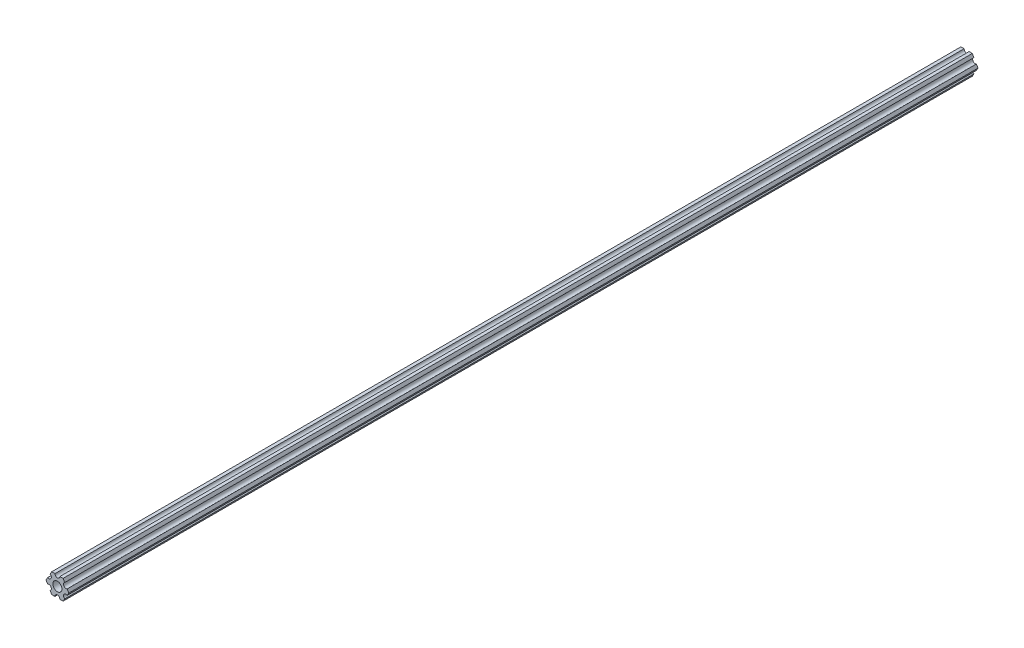
ISO-10303-21;
HEADER;
FILE_DESCRIPTION(('STEP AP214'),'2;1');
FILE_NAME('part.step','',(''),(''),'','','');
FILE_SCHEMA(('AUTOMOTIVE_DESIGN { 1 0 10303 214 1 1 1 1 }'));
ENDSEC;
DATA;
#1=APPLICATION_CONTEXT('core data for automotive mechanical design processes');
#2=APPLICATION_PROTOCOL_DEFINITION('international standard','automotive_design',2000,#1);
#3=PRODUCT_CONTEXT('',#1,'mechanical');
#4=PRODUCT('Part','Part','',(#3));
#5=PRODUCT_RELATED_PRODUCT_CATEGORY('part','',(#4));
#6=PRODUCT_DEFINITION_FORMATION('','',#4);
#7=PRODUCT_DEFINITION_CONTEXT('part definition',#1,'design');
#8=PRODUCT_DEFINITION('design','',#6,#7);
#9=PRODUCT_DEFINITION_SHAPE('','',#8);
#10=(LENGTH_UNIT() NAMED_UNIT(*) SI_UNIT(.MILLI.,.METRE.));
#11=(NAMED_UNIT(*) PLANE_ANGLE_UNIT() SI_UNIT($,.RADIAN.));
#12=(NAMED_UNIT(*) SI_UNIT($,.STERADIAN.) SOLID_ANGLE_UNIT());
#13=UNCERTAINTY_MEASURE_WITH_UNIT(LENGTH_MEASURE(1.E-05),#10,'distance_accuracy_value','');
#14=(GEOMETRIC_REPRESENTATION_CONTEXT(3) GLOBAL_UNCERTAINTY_ASSIGNED_CONTEXT((#13)) GLOBAL_UNIT_ASSIGNED_CONTEXT((#10,
#11,#12)) REPRESENTATION_CONTEXT('',''));
#15=CARTESIAN_POINT('',(0.,0.,0.));
#16=DIRECTION('',(0.,0.,1.));
#17=DIRECTION('',(1.,0.,0.));
#18=AXIS2_PLACEMENT_3D('',#15,#16,#17);
#19=CARTESIAN_POINT('',(6.29301142309098,-1.80018429024546,85.725));
#20=DIRECTION('',(-0.866025434075723,0.499999947533953,0.));
#21=DIRECTION('',(0.,0.,1.));
#22=AXIS2_PLACEMENT_3D('',#19,#20,#21);
#23=PLANE('',#22);
#24=DIRECTION('',(0.,0.,1.));
#25=VECTOR('',#24,1.);
#26=CARTESIAN_POINT('',(7.33234841870827,4.44212519169686E-07,85.725));
#27=LINE('',#26,#25);
#28=CARTESIAN_POINT('',(7.33234841870826,4.44212518961143E-07,-498.475));
#29=VERTEX_POINT('',#28);
#30=CARTESIAN_POINT('',(7.33234841870826,4.44212519315656E-07,85.725));
#31=VERTEX_POINT('',#30);
#32=EDGE_CURVE('E11',#29,#31,#27,.T.);
#33=ORIENTED_EDGE('',*,*,#32,.T.);
#34=DIRECTION('',(0.499999947533953,0.866025434075723,0.));
#35=VECTOR('',#34,1.);
#36=CARTESIAN_POINT('',(6.29301142309098,-1.80018429024546,85.725));
#37=LINE('',#36,#35);
#38=CARTESIAN_POINT('',(6.29301142309098,-1.80018429024546,85.725));
#39=VERTEX_POINT('',#38);
#40=EDGE_CURVE('E301',#39,#31,#37,.T.);
#41=ORIENTED_EDGE('',*,*,#40,.F.);
#42=DIRECTION('',(0.,0.,-1.));
#43=VECTOR('',#42,1.);
#44=CARTESIAN_POINT('',(6.29301142309098,-1.80018429024546,85.725));
#45=LINE('',#44,#43);
#46=CARTESIAN_POINT('',(6.29301142309098,-1.80018429024546,-498.475));
#47=VERTEX_POINT('',#46);
#48=EDGE_CURVE('E300',#39,#47,#45,.T.);
#49=ORIENTED_EDGE('',*,*,#48,.T.);
#50=DIRECTION('',(-0.499999947533953,-0.866025434075723,0.));
#51=VECTOR('',#50,1.);
#52=CARTESIAN_POINT('',(6.29301142309098,-1.80018429024546,-498.475));
#53=LINE('',#52,#51);
#54=EDGE_CURVE('E219',#29,#47,#53,.T.);
#55=ORIENTED_EDGE('',*,*,#54,.F.);
#56=EDGE_LOOP('',(#33,#41,#49,#55));
#57=FACE_BOUND('',#56,.T.);
#58=ADVANCED_FACE('F51',(#57),#23,.F.);
#59=CARTESIAN_POINT('',(7.33234841870827,4.44212519169686E-07,85.725));
#60=DIRECTION('',(-0.866025373493145,-0.500000052466057,0.));
#61=DIRECTION('',(-0.500000052466057,0.866025373493145,0.));
#62=AXIS2_PLACEMENT_3D('',#59,#60,#61);
#63=PLANE('',#62);
#64=DIRECTION('',(0.,0.,1.));
#65=VECTOR('',#64,1.);
#66=CARTESIAN_POINT('',(6.29301120497139,1.80018505273894,85.725));
#67=LINE('',#66,#65);
#68=CARTESIAN_POINT('',(6.29301120497139,1.80018505273894,-498.475));
#69=VERTEX_POINT('',#68);
#70=CARTESIAN_POINT('',(6.29301120497139,1.80018505273894,85.725));
#71=VERTEX_POINT('',#70);
#72=EDGE_CURVE('E59',#69,#71,#67,.T.);
#73=ORIENTED_EDGE('',*,*,#72,.T.);
#74=DIRECTION('',(-0.500000052466057,0.866025373493145,0.));
#75=VECTOR('',#74,1.);
#76=CARTESIAN_POINT('',(7.33234841870827,4.44212519198906E-07,85.725));
#77=LINE('',#76,#75);
#78=EDGE_CURVE('E305',#31,#71,#77,.T.);
#79=ORIENTED_EDGE('',*,*,#78,.F.);
#80=ORIENTED_EDGE('',*,*,#32,.F.);
#81=DIRECTION('',(0.500000052466055,-0.866025373493145,0.));
#82=VECTOR('',#81,1.);
#83=CARTESIAN_POINT('',(7.33234841870826,4.44212518961143E-07,-498.475));
#84=LINE('',#83,#82);
#85=EDGE_CURVE('E213',#69,#29,#84,.T.);
#86=ORIENTED_EDGE('',*,*,#85,.F.);
#87=EDGE_LOOP('',(#73,#79,#80,#86));
#88=FACE_BOUND('',#87,.T.);
#89=ADVANCED_FACE('F214',(#88),#63,.F.);
#90=CARTESIAN_POINT('',(4.70551103839172,4.54981561357972,85.725));
#91=DIRECTION('',(-0.866025373493151,-0.500000052466046,0.));
#92=DIRECTION('',(-0.500000052466046,0.866025373493151,0.));
#93=AXIS2_PLACEMENT_3D('',#90,#91,#92);
#94=PLANE('',#93);
#95=DIRECTION('',(0.,0.,1.));
#96=VECTOR('',#95,1.);
#97=CARTESIAN_POINT('',(3.66617382465481,6.35000022210627,85.725));
#98=LINE('',#97,#96);
#99=CARTESIAN_POINT('',(3.66617382465481,6.35000022210627,-498.475));
#100=VERTEX_POINT('',#99);
#101=CARTESIAN_POINT('',(3.66617382465481,6.35000022210627,85.725));
#102=VERTEX_POINT('',#101);
#103=EDGE_CURVE('E211',#100,#102,#98,.T.);
#104=ORIENTED_EDGE('',*,*,#103,.T.);
#105=DIRECTION('',(-0.500000052466046,0.866025373493151,0.));
#106=VECTOR('',#105,1.);
#107=CARTESIAN_POINT('',(4.70551103839172,4.54981561357972,85.725));
#108=LINE('',#107,#106);
#109=CARTESIAN_POINT('',(4.70551103839172,4.54981561357972,85.725));
#110=VERTEX_POINT('',#109);
#111=EDGE_CURVE('E336',#110,#102,#108,.T.);
#112=ORIENTED_EDGE('',*,*,#111,.F.);
#113=DIRECTION('',(0.,0.,1.));
#114=VECTOR('',#113,1.);
#115=CARTESIAN_POINT('',(4.70551103839172,4.54981561357972,85.725));
#116=LINE('',#115,#114);
#117=CARTESIAN_POINT('',(4.70551103839172,4.54981561357972,-498.475));
#118=VERTEX_POINT('',#117);
#119=EDGE_CURVE('E299',#118,#110,#116,.T.);
#120=ORIENTED_EDGE('',*,*,#119,.F.);
#121=DIRECTION('',(0.500000052466045,-0.866025373493151,0.));
#122=VECTOR('',#121,1.);
#123=CARTESIAN_POINT('',(4.70551103839172,4.54981561357972,-498.475));
#124=LINE('',#123,#122);
#125=EDGE_CURVE('E225',#100,#118,#124,.T.);
#126=ORIENTED_EDGE('',*,*,#125,.F.);
#127=EDGE_LOOP('',(#104,#112,#120,#126));
#128=FACE_BOUND('',#127,.T.);
#129=ADVANCED_FACE('F412',(#128),#94,.F.);
#130=CARTESIAN_POINT('',(3.66617382465481,6.35000022210627,85.725));
#131=DIRECTION('',(6.05825850611185E-08,-1.,0.));
#132=DIRECTION('',(0.,0.,-1.));
#133=AXIS2_PLACEMENT_3D('',#130,#131,#132);
#134=PLANE('',#133);
#135=DIRECTION('',(0.,0.,1.));
#136=VECTOR('',#135,1.);
#137=CARTESIAN_POINT('',(1.58749961530074,6.35000009617482,85.725));
#138=LINE('',#137,#136);
#139=CARTESIAN_POINT('',(1.58749961530073,6.35000015914054,-498.475));
#140=VERTEX_POINT('',#139);
#141=CARTESIAN_POINT('',(1.58749961530073,6.35000015914054,85.725));
#142=VERTEX_POINT('',#141);
#143=EDGE_CURVE('E333',#140,#142,#138,.T.);
#144=ORIENTED_EDGE('',*,*,#143,.T.);
#145=DIRECTION('',(-1.,0.,0.));
#146=VECTOR('',#145,1.);
#147=CARTESIAN_POINT('',(5.49926112168156,6.35000022210627,85.725));
#148=LINE('',#147,#146);
#149=EDGE_CURVE('E340',#102,#142,#148,.T.);
#150=ORIENTED_EDGE('',*,*,#149,.F.);
#151=ORIENTED_EDGE('',*,*,#103,.F.);
#152=DIRECTION('',(1.,3.02912931564594E-08,0.));
#153=VECTOR('',#152,1.);
#154=CARTESIAN_POINT('',(3.66617382465481,6.35000022210627,-498.475));
#155=LINE('',#154,#153);
#156=EDGE_CURVE('E287',#140,#100,#155,.T.);
#157=ORIENTED_EDGE('',*,*,#156,.F.);
#158=EDGE_LOOP('',(#144,#150,#151,#157));
#159=FACE_BOUND('',#158,.T.);
#160=ADVANCED_FACE('F415',(#159),#134,.F.);
#161=CARTESIAN_POINT('',(-3.84699260060323E-07,6.35,85.725));
#162=DIRECTION('',(0.,0.,-1.));
#163=DIRECTION('',(-1.,0.,0.));
#164=AXIS2_PLACEMENT_3D('',#161,#162,#163);
#165=CYLINDRICAL_SURFACE('',#164,1.5875);
#166=DIRECTION('',(0.,0.,1.));
#167=VECTOR('',#166,1.);
#168=CARTESIAN_POINT('',(-1.58750038469926,6.34999990382518,85.725));
#169=LINE('',#168,#167);
#170=CARTESIAN_POINT('',(-1.58750038469926,6.34999990382519,-498.475));
#171=VERTEX_POINT('',#170);
#172=CARTESIAN_POINT('',(-1.58750038469926,6.34999990382519,85.725));
#173=VERTEX_POINT('',#172);
#174=EDGE_CURVE('E330',#171,#173,#169,.T.);
#175=ORIENTED_EDGE('',*,*,#174,.T.);
#176=CARTESIAN_POINT('',(-3.84699260060323E-07,6.35,85.725));
#177=DIRECTION('',(0.,0.,-1.));
#178=DIRECTION('',(-1.,0.,0.));
#179=AXIS2_PLACEMENT_3D('',#176,#177,#178);
#180=CIRCLE('',#179,1.5875);
#181=EDGE_CURVE('E344',#142,#173,#180,.T.);
#182=ORIENTED_EDGE('',*,*,#181,.F.);
#183=ORIENTED_EDGE('',*,*,#143,.F.);
#184=CARTESIAN_POINT('',(-3.84699260060323E-07,6.35,-498.475));
#185=DIRECTION('',(0.,0.,1.));
#186=DIRECTION('',(-1.,0.,0.));
#187=AXIS2_PLACEMENT_3D('',#184,#185,#186);
#188=CIRCLE('',#187,1.5875);
#189=EDGE_CURVE('E283',#171,#140,#188,.T.);
#190=ORIENTED_EDGE('',*,*,#189,.F.);
#191=EDGE_LOOP('',(#175,#182,#183,#190));
#192=FACE_BOUND('',#191,.T.);
#193=ADVANCED_FACE('F464',(#192),#165,.F.);
#194=CARTESIAN_POINT('',(-1.58750038469926,6.34999990382518,85.725));
#195=DIRECTION('',(6.05825963273174E-08,-1.,0.));
#196=DIRECTION('',(0.,0.,-1.));
#197=AXIS2_PLACEMENT_3D('',#194,#195,#196);
#198=PLANE('',#197);
#199=DIRECTION('',(0.,0.,1.));
#200=VECTOR('',#199,1.);
#201=CARTESIAN_POINT('',(-3.66617459405349,6.3499997778937,85.725));
#202=LINE('',#201,#200);
#203=CARTESIAN_POINT('',(-3.66617454558244,6.34999986184803,-498.475));
#204=VERTEX_POINT('',#203);
#205=CARTESIAN_POINT('',(-3.66617454558244,6.34999986184803,85.725));
#206=VERTEX_POINT('',#205);
#207=EDGE_CURVE('E323',#204,#206,#202,.T.);
#208=ORIENTED_EDGE('',*,*,#207,.T.);
#209=DIRECTION('',(-1.,0.,0.));
#210=VECTOR('',#209,1.);
#211=CARTESIAN_POINT('',(5.49926112168156,6.34999990382519,85.725));
#212=LINE('',#211,#210);
#213=EDGE_CURVE('E348',#173,#206,#212,.T.);
#214=ORIENTED_EDGE('',*,*,#213,.F.);
#215=ORIENTED_EDGE('',*,*,#174,.F.);
#216=DIRECTION('',(1.,2.0194198968488E-08,0.));
#217=VECTOR('',#216,1.);
#218=CARTESIAN_POINT('',(-1.58750038469926,6.34999990382519,-498.475));
#219=LINE('',#218,#217);
#220=EDGE_CURVE('E279',#204,#171,#219,.T.);
#221=ORIENTED_EDGE('',*,*,#220,.F.);
#222=EDGE_LOOP('',(#208,#214,#215,#221));
#223=FACE_BOUND('',#222,.T.);
#224=ADVANCED_FACE('F461',(#223),#198,.F.);
#225=CARTESIAN_POINT('',(-3.66617459405349,6.3499997778937,85.725));
#226=DIRECTION('',(0.866025434075729,-0.499999947533942,0.));
#227=DIRECTION('',(0.,0.,-1.));
#228=AXIS2_PLACEMENT_3D('',#225,#226,#227);
#229=PLANE('',#228);
#230=DIRECTION('',(0.,0.,1.));
#231=VECTOR('',#230,1.);
#232=CARTESIAN_POINT('',(-4.70551158967065,4.54981504343587,85.725));
#233=LINE('',#232,#231);
#234=CARTESIAN_POINT('',(-4.70551158967065,4.54981504343587,-498.475));
#235=VERTEX_POINT('',#234);
#236=CARTESIAN_POINT('',(-4.70551158967065,4.54981504343587,85.725));
#237=VERTEX_POINT('',#236);
#238=EDGE_CURVE('E320',#235,#237,#233,.T.);
#239=ORIENTED_EDGE('',*,*,#238,.T.);
#240=DIRECTION('',(-0.499999947533943,-0.866025434075729,0.));
#241=VECTOR('',#240,1.);
#242=CARTESIAN_POINT('',(-3.66617459405349,6.3499997778937,85.725));
#243=LINE('',#242,#241);
#244=EDGE_CURVE('E352',#206,#237,#243,.T.);
#245=ORIENTED_EDGE('',*,*,#244,.F.);
#246=ORIENTED_EDGE('',*,*,#207,.F.);
#247=DIRECTION('',(0.499999947533939,0.866025434075731,0.));
#248=VECTOR('',#247,1.);
#249=CARTESIAN_POINT('',(-3.66617454558244,6.34999986184803,-498.475));
#250=LINE('',#249,#248);
#251=EDGE_CURVE('E275',#235,#204,#250,.T.);
#252=ORIENTED_EDGE('',*,*,#251,.F.);
#253=EDGE_LOOP('',(#239,#245,#246,#252));
#254=FACE_BOUND('',#253,.T.);
#255=ADVANCED_FACE('F457',(#254),#229,.F.);
#256=CARTESIAN_POINT('',(-5.49926150638082,3.17499966684067,85.725));
#257=DIRECTION('',(0.,0.,-1.));
#258=DIRECTION('',(-1.,0.,0.));
#259=AXIS2_PLACEMENT_3D('',#256,#257,#258);
#260=CYLINDRICAL_SURFACE('',#259,1.5875);
#261=DIRECTION('',(0.,0.,1.));
#262=VECTOR('',#261,1.);
#263=CARTESIAN_POINT('',(-6.29301142309098,1.80018429024547,85.725));
#264=LINE('',#263,#262);
#265=CARTESIAN_POINT('',(-6.29301142309098,1.80018429024546,-498.475));
#266=VERTEX_POINT('',#265);
#267=CARTESIAN_POINT('',(-6.29301142309098,1.80018429024547,85.725));
#268=VERTEX_POINT('',#267);
#269=EDGE_CURVE('E324',#266,#268,#264,.T.);
#270=ORIENTED_EDGE('',*,*,#269,.T.);
#271=CARTESIAN_POINT('',(-5.49926150638082,3.17499966684067,85.725));
#272=DIRECTION('',(0.,0.,-1.));
#273=DIRECTION('',(-1.,0.,0.));
#274=AXIS2_PLACEMENT_3D('',#271,#272,#273);
#275=CIRCLE('',#274,1.5875);
#276=EDGE_CURVE('E362',#237,#268,#275,.T.);
#277=ORIENTED_EDGE('',*,*,#276,.F.);
#278=ORIENTED_EDGE('',*,*,#238,.F.);
#279=CARTESIAN_POINT('',(-5.49926150638082,3.17499966684067,-498.475));
#280=DIRECTION('',(0.,0.,1.));
#281=DIRECTION('',(-1.,0.,0.));
#282=AXIS2_PLACEMENT_3D('',#279,#280,#281);
#283=CIRCLE('',#282,1.5875);
#284=EDGE_CURVE('E271',#266,#235,#283,.T.);
#285=ORIENTED_EDGE('',*,*,#284,.F.);
#286=EDGE_LOOP('',(#270,#277,#278,#285));
#287=FACE_BOUND('',#286,.T.);
#288=ADVANCED_FACE('F453',(#287),#260,.F.);
#289=CARTESIAN_POINT('',(-6.29301142309098,1.80018429024547,85.725));
#290=DIRECTION('',(0.866025434075724,-0.499999947533952,0.));
#291=DIRECTION('',(0.,0.,-1.));
#292=AXIS2_PLACEMENT_3D('',#289,#290,#291);
#293=PLANE('',#292);
#294=DIRECTION('',(0.,0.,1.));
#295=VECTOR('',#294,1.);
#296=CARTESIAN_POINT('',(-7.33234841870827,-4.44212523790841E-07,85.725));
#297=LINE('',#296,#295);
#298=CARTESIAN_POINT('',(-7.33234841870826,-4.44212524036367E-07,-498.475));
#299=VERTEX_POINT('',#298);
#300=CARTESIAN_POINT('',(-7.33234841870826,-4.44212524036367E-07,85.725));
#301=VERTEX_POINT('',#300);
#302=EDGE_CURVE('E317',#299,#301,#297,.T.);
#303=ORIENTED_EDGE('',*,*,#302,.T.);
#304=DIRECTION('',(-0.499999947533952,-0.866025434075724,0.));
#305=VECTOR('',#304,1.);
#306=CARTESIAN_POINT('',(-6.29301142309098,1.80018429024547,85.725));
#307=LINE('',#306,#305);
#308=EDGE_CURVE('E358',#268,#301,#307,.T.);
#309=ORIENTED_EDGE('',*,*,#308,.F.);
#310=ORIENTED_EDGE('',*,*,#269,.F.);
#311=DIRECTION('',(0.499999947533951,0.866025434075724,0.));
#312=VECTOR('',#311,1.);
#313=CARTESIAN_POINT('',(-6.29301142309098,1.80018429024547,-498.475));
#314=LINE('',#313,#312);
#315=EDGE_CURVE('E267',#299,#266,#314,.T.);
#316=ORIENTED_EDGE('',*,*,#315,.F.);
#317=EDGE_LOOP('',(#303,#309,#310,#316));
#318=FACE_BOUND('',#317,.T.);
#319=ADVANCED_FACE('F449',(#318),#293,.F.);
#320=CARTESIAN_POINT('',(-7.33234841870827,-4.44212523790841E-07,85.725));
#321=DIRECTION('',(0.866025373493151,0.500000052466045,0.));
#322=DIRECTION('',(0.,0.,-1.));
#323=AXIS2_PLACEMENT_3D('',#320,#321,#322);
#324=PLANE('',#323);
#325=DIRECTION('',(0.,0.,1.));
#326=VECTOR('',#325,1.);
#327=CARTESIAN_POINT('',(-6.29301120497141,-1.80018505273897,85.725));
#328=LINE('',#327,#326);
#329=CARTESIAN_POINT('',(-6.29301120497141,-1.80018505273897,-498.475));
#330=VERTEX_POINT('',#329);
#331=CARTESIAN_POINT('',(-6.29301120497141,-1.80018505273897,85.725));
#332=VERTEX_POINT('',#331);
#333=EDGE_CURVE('E310',#330,#332,#328,.T.);
#334=ORIENTED_EDGE('',*,*,#333,.T.);
#335=DIRECTION('',(0.500000052466045,-0.866025373493151,0.));
#336=VECTOR('',#335,1.);
#337=CARTESIAN_POINT('',(-7.33234841870827,-4.44212523969395E-07,85.725));
#338=LINE('',#337,#336);
#339=EDGE_CURVE('E353',#301,#332,#338,.T.);
#340=ORIENTED_EDGE('',*,*,#339,.F.);
#341=ORIENTED_EDGE('',*,*,#302,.F.);
#342=DIRECTION('',(-0.500000052466045,0.866025373493152,0.));
#343=VECTOR('',#342,1.);
#344=CARTESIAN_POINT('',(-7.33234841870826,-4.44212524036367E-07,-498.475));
#345=LINE('',#344,#343);
#346=EDGE_CURVE('E263',#330,#299,#345,.T.);
#347=ORIENTED_EDGE('',*,*,#346,.F.);
#348=EDGE_LOOP('',(#334,#340,#341,#347));
#349=FACE_BOUND('',#348,.T.);
#350=ADVANCED_FACE('F445',(#349),#324,.F.);
#351=CARTESIAN_POINT('',(-5.49926112168156,-3.17500033315934,85.725));
#352=DIRECTION('',(0.,0.,-1.));
#353=DIRECTION('',(-1.,0.,0.));
#354=AXIS2_PLACEMENT_3D('',#351,#352,#353);
#355=CYLINDRICAL_SURFACE('',#354,1.5875);
#356=DIRECTION('',(0.,0.,1.));
#357=VECTOR('',#356,1.);
#358=CARTESIAN_POINT('',(-4.70551103839172,-4.54981561357972,85.725));
#359=LINE('',#358,#357);
#360=CARTESIAN_POINT('',(-4.70551103839172,-4.54981561357972,-498.475));
#361=VERTEX_POINT('',#360);
#362=CARTESIAN_POINT('',(-4.70551103839172,-4.54981561357972,85.725));
#363=VERTEX_POINT('',#362);
#364=EDGE_CURVE('E307',#361,#363,#359,.T.);
#365=ORIENTED_EDGE('',*,*,#364,.T.);
#366=CARTESIAN_POINT('',(-5.49926112168156,-3.17500033315934,85.725));
#367=DIRECTION('',(0.,0.,-1.));
#368=DIRECTION('',(-1.,0.,0.));
#369=AXIS2_PLACEMENT_3D('',#366,#367,#368);
#370=CIRCLE('',#369,1.5875);
#371=EDGE_CURVE('E357',#332,#363,#370,.T.);
#372=ORIENTED_EDGE('',*,*,#371,.F.);
#373=ORIENTED_EDGE('',*,*,#333,.F.);
#374=CARTESIAN_POINT('',(-5.49926112168156,-3.17500033315934,-498.475));
#375=DIRECTION('',(0.,0.,1.));
#376=DIRECTION('',(-1.,0.,0.));
#377=AXIS2_PLACEMENT_3D('',#374,#375,#376);
#378=CIRCLE('',#377,1.5875);
#379=EDGE_CURVE('E259',#361,#330,#378,.T.);
#380=ORIENTED_EDGE('',*,*,#379,.F.);
#381=EDGE_LOOP('',(#365,#372,#373,#380));
#382=FACE_BOUND('',#381,.T.);
#383=ADVANCED_FACE('F441',(#382),#355,.F.);
#384=CARTESIAN_POINT('',(-4.70551103839172,-4.54981561357972,85.725));
#385=DIRECTION('',(0.866025373493152,0.500000052466045,0.));
#386=DIRECTION('',(0.,0.,-1.));
#387=AXIS2_PLACEMENT_3D('',#384,#385,#386);
#388=PLANE('',#387);
#389=DIRECTION('',(0.,0.,1.));
#390=VECTOR('',#389,1.);
#391=CARTESIAN_POINT('',(-3.66617382465481,-6.35000022210628,85.725));
#392=LINE('',#391,#390);
#393=CARTESIAN_POINT('',(-3.66617382465481,-6.35000022210628,-498.475));
#394=VERTEX_POINT('',#393);
#395=CARTESIAN_POINT('',(-3.66617382465481,-6.35000022210628,85.725));
#396=VERTEX_POINT('',#395);
#397=EDGE_CURVE('E311',#394,#396,#392,.T.);
#398=ORIENTED_EDGE('',*,*,#397,.T.);
#399=DIRECTION('',(0.500000052466045,-0.866025373493151,0.));
#400=VECTOR('',#399,1.);
#401=CARTESIAN_POINT('',(-4.70551103839172,-4.54981561357972,85.725));
#402=LINE('',#401,#400);
#403=EDGE_CURVE('E372',#363,#396,#402,.T.);
#404=ORIENTED_EDGE('',*,*,#403,.F.);
#405=ORIENTED_EDGE('',*,*,#364,.F.);
#406=DIRECTION('',(-0.500000052466043,0.866025373493152,0.));
#407=VECTOR('',#406,1.);
#408=CARTESIAN_POINT('',(-4.70551103839172,-4.54981561357972,-498.475));
#409=LINE('',#408,#407);
#410=EDGE_CURVE('E255',#394,#361,#409,.T.);
#411=ORIENTED_EDGE('',*,*,#410,.F.);
#412=EDGE_LOOP('',(#398,#404,#405,#411));
#413=FACE_BOUND('',#412,.T.);
#414=ADVANCED_FACE('F437',(#413),#388,.F.);
#415=CARTESIAN_POINT('',(-3.66617382465481,-6.35000022210628,85.725));
#416=DIRECTION('',(-6.05825854783851E-08,1.,0.));
#417=DIRECTION('',(0.,0.,1.));
#418=AXIS2_PLACEMENT_3D('',#415,#416,#417);
#419=PLANE('',#418);
#420=DIRECTION('',(0.,0.,1.));
#421=VECTOR('',#420,1.);
#422=CARTESIAN_POINT('',(-1.58749961530074,-6.35,85.725));
#423=LINE('',#422,#421);
#424=CARTESIAN_POINT('',(-1.58749961530073,-6.35000011105314,-498.475));
#425=VERTEX_POINT('',#424);
#426=CARTESIAN_POINT('',(-1.58749961530073,-6.35000011105314,85.725));
#427=VERTEX_POINT('',#426);
#428=EDGE_CURVE('E82',#425,#427,#423,.T.);
#429=ORIENTED_EDGE('',*,*,#428,.T.);
#430=DIRECTION('',(1.,0.,0.));
#431=VECTOR('',#430,1.);
#432=CARTESIAN_POINT('',(5.49926112168156,-6.35000022210628,85.725));
#433=LINE('',#432,#431);
#434=EDGE_CURVE('E376',#396,#427,#433,.T.);
#435=ORIENTED_EDGE('',*,*,#434,.F.);
#436=ORIENTED_EDGE('',*,*,#397,.F.);
#437=DIRECTION('',(-0.999999999999999,-5.34249856349036E-08,0.));
#438=VECTOR('',#437,1.);
#439=CARTESIAN_POINT('',(-3.66617382465481,-6.35000022210628,-498.475));
#440=LINE('',#439,#438);
#441=EDGE_CURVE('E251',#425,#394,#440,.T.);
#442=ORIENTED_EDGE('',*,*,#441,.F.);
#443=EDGE_LOOP('',(#429,#435,#436,#442));
#444=FACE_BOUND('',#443,.T.);
#445=ADVANCED_FACE('F434',(#444),#419,.F.);
#446=CARTESIAN_POINT('',(3.8469926204343E-07,-6.35,85.725));
#447=DIRECTION('',(0.,0.,-1.));
#448=DIRECTION('',(-1.,0.,0.));
#449=AXIS2_PLACEMENT_3D('',#446,#447,#448);
#450=CYLINDRICAL_SURFACE('',#449,1.5875);
#451=DIRECTION('',(0.,0.,1.));
#452=VECTOR('',#451,1.);
#453=CARTESIAN_POINT('',(1.58750038469926,-6.34999990382518,85.725));
#454=LINE('',#453,#452);
#455=CARTESIAN_POINT('',(1.58750038469926,-6.34999990382519,-498.475));
#456=VERTEX_POINT('',#455);
#457=CARTESIAN_POINT('',(1.58750038469926,-6.34999990382519,85.725));
#458=VERTEX_POINT('',#457);
#459=EDGE_CURVE('E71',#456,#458,#454,.T.);
#460=ORIENTED_EDGE('',*,*,#459,.T.);
#461=CARTESIAN_POINT('',(3.8469926204343E-07,-6.35,85.725));
#462=DIRECTION('',(0.,0.,-1.));
#463=DIRECTION('',(-1.,0.,0.));
#464=AXIS2_PLACEMENT_3D('',#461,#462,#463);
#465=CIRCLE('',#464,1.5875);
#466=EDGE_CURVE('E380',#427,#458,#465,.T.);
#467=ORIENTED_EDGE('',*,*,#466,.F.);
#468=ORIENTED_EDGE('',*,*,#428,.F.);
#469=CARTESIAN_POINT('',(3.8469926204343E-07,-6.35,-498.475));
#470=DIRECTION('',(0.,0.,1.));
#471=DIRECTION('',(-1.,0.,0.));
#472=AXIS2_PLACEMENT_3D('',#469,#470,#471);
#473=CIRCLE('',#472,1.5875);
#474=EDGE_CURVE('E247',#456,#425,#473,.T.);
#475=ORIENTED_EDGE('',*,*,#474,.F.);
#476=EDGE_LOOP('',(#460,#467,#468,#475));
#477=FACE_BOUND('',#476,.T.);
#478=ADVANCED_FACE('F432',(#477),#450,.F.);
#479=CARTESIAN_POINT('',(1.58750038469926,-6.34999990382518,85.725));
#480=DIRECTION('',(-6.05825721258438E-08,1.,0.));
#481=DIRECTION('',(0.,0.,1.));
#482=AXIS2_PLACEMENT_3D('',#479,#480,#481);
#483=PLANE('',#482);
#484=DIRECTION('',(0.,0.,1.));
#485=VECTOR('',#484,1.);
#486=CARTESIAN_POINT('',(3.66617459405346,-6.34999977789375,85.725));
#487=LINE('',#486,#485);
#488=CARTESIAN_POINT('',(3.66617454558244,-6.34999986184804,-498.475));
#489=VERTEX_POINT('',#488);
#490=CARTESIAN_POINT('',(3.66617454558244,-6.34999986184804,85.725));
#491=VERTEX_POINT('',#490);
#492=EDGE_CURVE('E381',#489,#491,#487,.T.);
#493=ORIENTED_EDGE('',*,*,#492,.T.);
#494=DIRECTION('',(1.,0.,0.));
#495=VECTOR('',#494,1.);
#496=CARTESIAN_POINT('',(5.49926112168156,-6.34999990382519,85.725));
#497=LINE('',#496,#495);
#498=EDGE_CURVE('E388',#458,#491,#497,.T.);
#499=ORIENTED_EDGE('',*,*,#498,.F.);
#500=ORIENTED_EDGE('',*,*,#459,.F.);
#501=DIRECTION('',(-1.,-2.01941943785532E-08,0.));
#502=VECTOR('',#501,1.);
#503=CARTESIAN_POINT('',(1.58750038469926,-6.34999990382519,-498.475));
#504=LINE('',#503,#502);
#505=EDGE_CURVE('E243',#489,#456,#504,.T.);
#506=ORIENTED_EDGE('',*,*,#505,.F.);
#507=EDGE_LOOP('',(#493,#499,#500,#506));
#508=FACE_BOUND('',#507,.T.);
#509=ADVANCED_FACE('F431',(#508),#483,.F.);
#510=CARTESIAN_POINT('',(3.66617459405346,-6.34999977789375,85.725));
#511=DIRECTION('',(-0.86602543407573,0.499999947533941,0.));
#512=DIRECTION('',(0.,0.,1.));
#513=AXIS2_PLACEMENT_3D('',#510,#511,#512);
#514=PLANE('',#513);
#515=DIRECTION('',(0.,0.,-1.));
#516=VECTOR('',#515,1.);
#517=CARTESIAN_POINT('',(4.70551158967065,-4.54981504343587,85.725));
#518=LINE('',#517,#516);
#519=CARTESIAN_POINT('',(4.70551158967065,-4.54981504343587,85.725));
#520=VERTEX_POINT('',#519);
#521=CARTESIAN_POINT('',(4.70551158967065,-4.54981504343587,-498.475));
#522=VERTEX_POINT('',#521);
#523=EDGE_CURVE('E384',#520,#522,#518,.T.);
#524=ORIENTED_EDGE('',*,*,#523,.F.);
#525=DIRECTION('',(0.49999994753394,0.86602543407573,0.));
#526=VECTOR('',#525,1.);
#527=CARTESIAN_POINT('',(3.66617459405346,-6.34999977789376,85.725));
#528=LINE('',#527,#526);
#529=EDGE_CURVE('E306',#491,#520,#528,.T.);
#530=ORIENTED_EDGE('',*,*,#529,.F.);
#531=ORIENTED_EDGE('',*,*,#492,.F.);
#532=DIRECTION('',(-0.499999947533941,-0.86602543407573,0.));
#533=VECTOR('',#532,1.);
#534=CARTESIAN_POINT('',(3.66617454558244,-6.34999986184804,-498.475));
#535=LINE('',#534,#533);
#536=EDGE_CURVE('E239',#522,#489,#535,.T.);
#537=ORIENTED_EDGE('',*,*,#536,.F.);
#538=EDGE_LOOP('',(#524,#530,#531,#537));
#539=FACE_BOUND('',#538,.T.);
#540=ADVANCED_FACE('F428',(#539),#514,.F.);
#541=CARTESIAN_POINT('',(5.49926112168156,3.17500033315934,85.725));
#542=DIRECTION('',(0.,0.,1.));
#543=DIRECTION('',(1.,0.,0.));
#544=AXIS2_PLACEMENT_3D('',#541,#542,#543);
#545=PLANE('',#544);
#546=CARTESIAN_POINT('',(0.,0.,85.725));
#547=DIRECTION('',(0.,0.,-1.));
#548=DIRECTION('',(-1.,0.,0.));
#549=AXIS2_PLACEMENT_3D('',#546,#547,#548);
#550=CIRCLE('',#549,2.9337);
#551=CARTESIAN_POINT('',(-2.9337,0.,85.725));
#552=VERTEX_POINT('',#551);
#553=EDGE_CURVE('E292',#552,#552,#550,.T.);
#554=ORIENTED_EDGE('',*,*,#553,.T.);
#555=EDGE_LOOP('',(#554));
#556=FACE_BOUND('',#555,.T.);
#557=ORIENTED_EDGE('',*,*,#529,.T.);
#558=CARTESIAN_POINT('',(5.49926150638082,-3.17499966684067,85.725));
#559=DIRECTION('',(0.,0.,-1.));
#560=DIRECTION('',(-1.,0.,0.));
#561=AXIS2_PLACEMENT_3D('',#558,#559,#560);
#562=CIRCLE('',#561,1.5875);
#563=EDGE_CURVE('E296',#520,#39,#562,.T.);
#564=ORIENTED_EDGE('',*,*,#563,.T.);
#565=ORIENTED_EDGE('',*,*,#40,.T.);
#566=ORIENTED_EDGE('',*,*,#78,.T.);
#567=CARTESIAN_POINT('',(5.49926112168156,3.17500033315934,85.725));
#568=DIRECTION('',(0.,0.,-1.));
#569=DIRECTION('',(-1.,0.,0.));
#570=AXIS2_PLACEMENT_3D('',#567,#568,#569);
#571=CIRCLE('',#570,1.5875);
#572=EDGE_CURVE('E206',#71,#110,#571,.T.);
#573=ORIENTED_EDGE('',*,*,#572,.T.);
#574=ORIENTED_EDGE('',*,*,#111,.T.);
#575=ORIENTED_EDGE('',*,*,#149,.T.);
#576=ORIENTED_EDGE('',*,*,#181,.T.);
#577=ORIENTED_EDGE('',*,*,#213,.T.);
#578=ORIENTED_EDGE('',*,*,#244,.T.);
#579=ORIENTED_EDGE('',*,*,#276,.T.);
#580=ORIENTED_EDGE('',*,*,#308,.T.);
#581=ORIENTED_EDGE('',*,*,#339,.T.);
#582=ORIENTED_EDGE('',*,*,#371,.T.);
#583=ORIENTED_EDGE('',*,*,#403,.T.);
#584=ORIENTED_EDGE('',*,*,#434,.T.);
#585=ORIENTED_EDGE('',*,*,#466,.T.);
#586=ORIENTED_EDGE('',*,*,#498,.T.);
#587=EDGE_LOOP('',(#557,#564,#565,#566,#573,#574,#575,#576,#577,#578,#579,#580,#581,#582,#583,
#584,#585,#586));
#588=FACE_BOUND('',#587,.T.);
#589=ADVANCED_FACE('F418',(#556,#588),#545,.T.);
#590=CARTESIAN_POINT('',(5.49926112168156,3.17500033315934,85.725));
#591=DIRECTION('',(0.,0.,-1.));
#592=DIRECTION('',(-1.,0.,0.));
#593=AXIS2_PLACEMENT_3D('',#590,#591,#592);
#594=CYLINDRICAL_SURFACE('',#593,1.5875);
#595=ORIENTED_EDGE('',*,*,#572,.F.);
#596=ORIENTED_EDGE('',*,*,#72,.F.);
#597=CARTESIAN_POINT('',(5.49926112168156,3.17500033315934,-498.475));
#598=DIRECTION('',(0.,0.,1.));
#599=DIRECTION('',(-1.,0.,0.));
#600=AXIS2_PLACEMENT_3D('',#597,#598,#599);
#601=CIRCLE('',#600,1.5875);
#602=EDGE_CURVE('E203',#118,#69,#601,.T.);
#603=ORIENTED_EDGE('',*,*,#602,.F.);
#604=ORIENTED_EDGE('',*,*,#119,.T.);
#605=EDGE_LOOP('',(#595,#596,#603,#604));
#606=FACE_BOUND('',#605,.T.);
#607=ADVANCED_FACE('F200',(#606),#594,.F.);
#608=CARTESIAN_POINT('',(5.49926150638082,-3.17499966684067,85.725));
#609=DIRECTION('',(0.,0.,-1.));
#610=DIRECTION('',(-1.,0.,0.));
#611=AXIS2_PLACEMENT_3D('',#608,#609,#610);
#612=CYLINDRICAL_SURFACE('',#611,1.5875);
#613=ORIENTED_EDGE('',*,*,#563,.F.);
#614=ORIENTED_EDGE('',*,*,#523,.T.);
#615=CARTESIAN_POINT('',(5.49926150638082,-3.17499966684067,-498.475));
#616=DIRECTION('',(0.,0.,1.));
#617=DIRECTION('',(-1.,0.,0.));
#618=AXIS2_PLACEMENT_3D('',#615,#616,#617);
#619=CIRCLE('',#618,1.5875);
#620=EDGE_CURVE('E235',#47,#522,#619,.T.);
#621=ORIENTED_EDGE('',*,*,#620,.F.);
#622=ORIENTED_EDGE('',*,*,#48,.F.);
#623=EDGE_LOOP('',(#613,#614,#621,#622));
#624=FACE_BOUND('',#623,.T.);
#625=ADVANCED_FACE('F423',(#624),#612,.F.);
#626=CARTESIAN_POINT('',(0.,0.,85.725));
#627=DIRECTION('',(0.,0.,-1.));
#628=DIRECTION('',(-1.,0.,0.));
#629=AXIS2_PLACEMENT_3D('',#626,#627,#628);
#630=CYLINDRICAL_SURFACE('',#629,2.9337);
#631=ORIENTED_EDGE('',*,*,#553,.F.);
#632=EDGE_LOOP('',(#631));
#633=FACE_BOUND('',#632,.T.);
#634=CARTESIAN_POINT('',(0.,0.,-498.475));
#635=DIRECTION('',(0.,0.,-1.));
#636=DIRECTION('',(-1.,0.,0.));
#637=AXIS2_PLACEMENT_3D('',#634,#635,#636);
#638=CIRCLE('',#637,2.9337);
#639=CARTESIAN_POINT('',(-2.9337,0.,-498.475));
#640=VERTEX_POINT('',#639);
#641=EDGE_CURVE('E227',#640,#640,#638,.T.);
#642=ORIENTED_EDGE('',*,*,#641,.T.);
#643=EDGE_LOOP('',(#642));
#644=FACE_BOUND('',#643,.T.);
#645=ADVANCED_FACE('F483',(#633,#644),#630,.F.);
#646=CARTESIAN_POINT('',(5.49926112168156,3.17500033315934,-498.475));
#647=DIRECTION('',(0.,0.,-1.));
#648=DIRECTION('',(-1.,0.,0.));
#649=AXIS2_PLACEMENT_3D('',#646,#647,#648);
#650=PLANE('',#649);
#651=ORIENTED_EDGE('',*,*,#602,.T.);
#652=ORIENTED_EDGE('',*,*,#85,.T.);
#653=ORIENTED_EDGE('',*,*,#54,.T.);
#654=ORIENTED_EDGE('',*,*,#620,.T.);
#655=ORIENTED_EDGE('',*,*,#536,.T.);
#656=ORIENTED_EDGE('',*,*,#505,.T.);
#657=ORIENTED_EDGE('',*,*,#474,.T.);
#658=ORIENTED_EDGE('',*,*,#441,.T.);
#659=ORIENTED_EDGE('',*,*,#410,.T.);
#660=ORIENTED_EDGE('',*,*,#379,.T.);
#661=ORIENTED_EDGE('',*,*,#346,.T.);
#662=ORIENTED_EDGE('',*,*,#315,.T.);
#663=ORIENTED_EDGE('',*,*,#284,.T.);
#664=ORIENTED_EDGE('',*,*,#251,.T.);
#665=ORIENTED_EDGE('',*,*,#220,.T.);
#666=ORIENTED_EDGE('',*,*,#189,.T.);
#667=ORIENTED_EDGE('',*,*,#156,.T.);
#668=ORIENTED_EDGE('',*,*,#125,.T.);
#669=EDGE_LOOP('',(#651,#652,#653,#654,#655,#656,#657,#658,#659,#660,#661,#662,#663,#664,#665,
#666,#667,#668));
#670=FACE_BOUND('',#669,.T.);
#671=ORIENTED_EDGE('',*,*,#641,.F.);
#672=EDGE_LOOP('',(#671));
#673=FACE_BOUND('',#672,.T.);
#674=ADVANCED_FACE('F221',(#670,#673),#650,.T.);
#675=CLOSED_SHELL('',(#58,#89,#129,#160,#193,#224,#255,#288,#319,#350,#383,#414,#445,#478,#509,
#540,#589,#607,#625,#645,#674));
#676=MANIFOLD_SOLID_BREP('B2',#675);
#677=ADVANCED_BREP_SHAPE_REPRESENTATION('',(#18,#676),#14);
#678=SHAPE_DEFINITION_REPRESENTATION(#9,#677);
ENDSEC;
END-ISO-10303-21;
